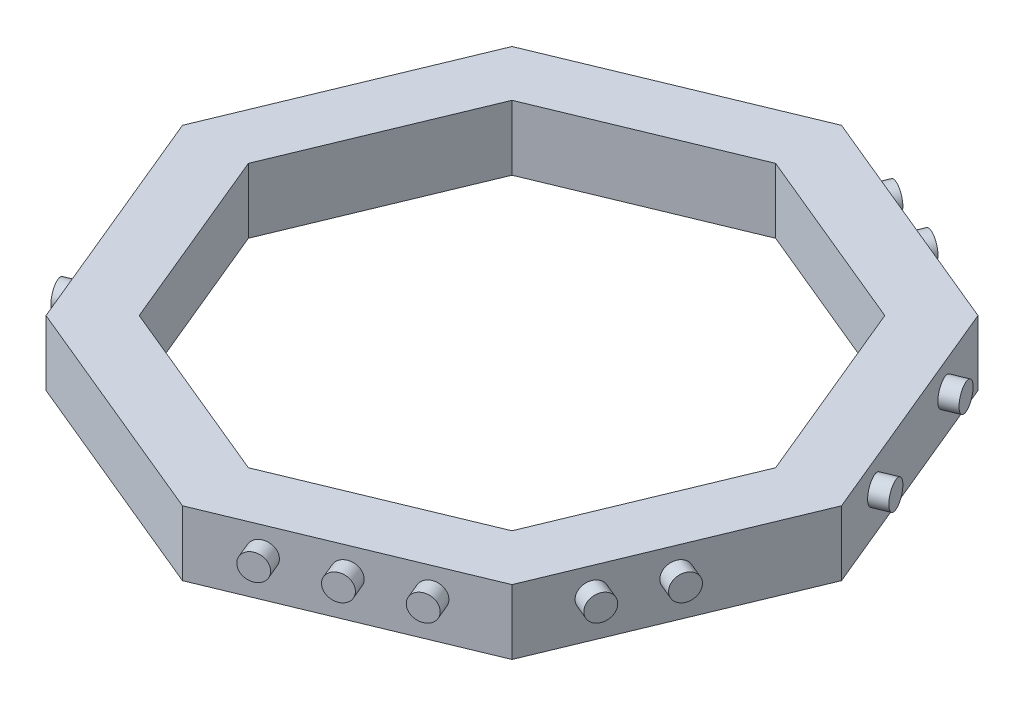
ISO-10303-21;
HEADER;
FILE_DESCRIPTION(('STEP AP214'),'2;1');
FILE_NAME('part.step','',(''),(''),'','','');
FILE_SCHEMA(('AUTOMOTIVE_DESIGN { 1 0 10303 214 1 1 1 1 }'));
ENDSEC;
DATA;
#1=APPLICATION_CONTEXT('core data for automotive mechanical design processes');
#2=APPLICATION_PROTOCOL_DEFINITION('international standard','automotive_design',2000,#1);
#3=PRODUCT_CONTEXT('',#1,'mechanical');
#4=PRODUCT('Part','Part','',(#3));
#5=PRODUCT_RELATED_PRODUCT_CATEGORY('part','',(#4));
#6=PRODUCT_DEFINITION_FORMATION('','',#4);
#7=PRODUCT_DEFINITION_CONTEXT('part definition',#1,'design');
#8=PRODUCT_DEFINITION('design','',#6,#7);
#9=PRODUCT_DEFINITION_SHAPE('','',#8);
#10=(LENGTH_UNIT() NAMED_UNIT(*) SI_UNIT(.MILLI.,.METRE.));
#11=(NAMED_UNIT(*) PLANE_ANGLE_UNIT() SI_UNIT($,.RADIAN.));
#12=(NAMED_UNIT(*) SI_UNIT($,.STERADIAN.) SOLID_ANGLE_UNIT());
#13=UNCERTAINTY_MEASURE_WITH_UNIT(LENGTH_MEASURE(1.E-05),#10,'distance_accuracy_value','');
#14=(GEOMETRIC_REPRESENTATION_CONTEXT(3) GLOBAL_UNCERTAINTY_ASSIGNED_CONTEXT((#13)) GLOBAL_UNIT_ASSIGNED_CONTEXT((#10,
#11,#12)) REPRESENTATION_CONTEXT('',''));
#15=CARTESIAN_POINT('',(0.,0.,0.));
#16=DIRECTION('',(0.,0.,1.));
#17=DIRECTION('',(1.,0.,0.));
#18=AXIS2_PLACEMENT_3D('',#15,#16,#17);
#19=CARTESIAN_POINT('',(17.9605122421385,5.,17.9605122421381));
#20=DIRECTION('',(-0.923879532511291,0.,-0.38268343236508));
#21=DIRECTION('',(-0.38268343236508,0.,0.923879532511291));
#22=AXIS2_PLACEMENT_3D('',#19,#20,#21);
#23=PLANE('',#22);
#24=CARTESIAN_POINT('',(21.6802561210693,3.,8.98025612106892));
#25=DIRECTION('',(-0.923879532511291,0.,-0.38268343236508));
#26=DIRECTION('',(-0.38268343236508,0.,0.923879532511291));
#27=AXIS2_PLACEMENT_3D('',#24,#25,#26);
#28=CIRCLE('',#27,1.);
#29=CARTESIAN_POINT('',(21.2975726887042,3.,9.90413565358022));
#30=VERTEX_POINT('',#29);
#31=EDGE_CURVE('E11',#30,#30,#28,.F.);
#32=ORIENTED_EDGE('',*,*,#31,.F.);
#33=EDGE_LOOP('',(#32));
#34=FACE_BOUND('',#33,.T.);
#35=CARTESIAN_POINT('',(19.7668389592439,3.,13.5996537836254));
#36=DIRECTION('',(-0.923879532511291,0.,-0.38268343236508));
#37=DIRECTION('',(-0.38268343236508,0.,0.923879532511291));
#38=AXIS2_PLACEMENT_3D('',#35,#36,#37);
#39=CIRCLE('',#38,1.);
#40=CARTESIAN_POINT('',(19.3841555268788,3.,14.5235333161367));
#41=VERTEX_POINT('',#40);
#42=EDGE_CURVE('E40',#41,#41,#39,.F.);
#43=ORIENTED_EDGE('',*,*,#42,.F.);
#44=EDGE_LOOP('',(#43));
#45=FACE_BOUND('',#44,.T.);
#46=DIRECTION('',(0.38268343236508,0.,-0.923879532511291));
#47=VECTOR('',#46,1.);
#48=CARTESIAN_POINT('',(17.9605122421385,0.,17.9605122421381));
#49=LINE('',#48,#47);
#50=CARTESIAN_POINT('',(17.9605122421385,0.,17.9605122421381));
#51=VERTEX_POINT('',#50);
#52=CARTESIAN_POINT('',(25.4,0.,-2.74086309204336E-13));
#53=VERTEX_POINT('',#52);
#54=EDGE_CURVE('E205',#51,#53,#49,.T.);
#55=ORIENTED_EDGE('',*,*,#54,.T.);
#56=DIRECTION('',(0.,-1.,0.));
#57=VECTOR('',#56,1.);
#58=CARTESIAN_POINT('',(25.4,5.,-2.74086309204336E-13));
#59=LINE('',#58,#57);
#60=CARTESIAN_POINT('',(25.4,5.,-2.74086309204336E-13));
#61=VERTEX_POINT('',#60);
#62=EDGE_CURVE('E271',#61,#53,#59,.T.);
#63=ORIENTED_EDGE('',*,*,#62,.F.);
#64=DIRECTION('',(0.38268343236508,0.,-0.923879532511291));
#65=VECTOR('',#64,1.);
#66=CARTESIAN_POINT('',(17.9605122421385,5.,17.9605122421381));
#67=LINE('',#66,#65);
#68=CARTESIAN_POINT('',(17.9605122421385,5.,17.9605122421381));
#69=VERTEX_POINT('',#68);
#70=EDGE_CURVE('E217',#69,#61,#67,.T.);
#71=ORIENTED_EDGE('',*,*,#70,.F.);
#72=DIRECTION('',(0.,-1.,0.));
#73=VECTOR('',#72,1.);
#74=CARTESIAN_POINT('',(17.9605122421385,5.,17.9605122421381));
#75=LINE('',#74,#73);
#76=EDGE_CURVE('E235',#69,#51,#75,.T.);
#77=ORIENTED_EDGE('',*,*,#76,.T.);
#78=EDGE_LOOP('',(#55,#63,#71,#77));
#79=FACE_BOUND('',#78,.T.);
#80=ADVANCED_FACE('F33',(#34,#45,#79),#23,.F.);
#81=CARTESIAN_POINT('',(25.4,5.,-2.74086309204336E-13));
#82=DIRECTION('',(-0.923879532511283,0.,0.3826834323651));
#83=DIRECTION('',(0.3826834323651,0.,0.923879532511283));
#84=AXIS2_PLACEMENT_3D('',#81,#82,#83);
#85=PLANE('',#84);
#86=CARTESIAN_POINT('',(19.7668389592436,3.,-13.5996537836258));
#87=DIRECTION('',(-0.923879532511283,0.,0.3826834323651));
#88=DIRECTION('',(0.3826834323651,0.,0.923879532511283));
#89=AXIS2_PLACEMENT_3D('',#86,#87,#88);
#90=CIRCLE('',#89,1.);
#91=CARTESIAN_POINT('',(20.1495223916087,3.,-12.6757742511145));
#92=VERTEX_POINT('',#91);
#93=EDGE_CURVE('E301',#92,#92,#90,.F.);
#94=ORIENTED_EDGE('',*,*,#93,.F.);
#95=EDGE_LOOP('',(#94));
#96=FACE_BOUND('',#95,.T.);
#97=CARTESIAN_POINT('',(23.5936732828946,3.,-4.36085845851299));
#98=DIRECTION('',(-0.923879532511283,0.,0.3826834323651));
#99=DIRECTION('',(0.3826834323651,0.,0.923879532511283));
#100=AXIS2_PLACEMENT_3D('',#97,#98,#99);
#101=CIRCLE('',#100,1.);
#102=CARTESIAN_POINT('',(23.9763567152597,3.,-3.43697892600171));
#103=VERTEX_POINT('',#102);
#104=EDGE_CURVE('E298',#103,#103,#101,.F.);
#105=ORIENTED_EDGE('',*,*,#104,.F.);
#106=EDGE_LOOP('',(#105));
#107=FACE_BOUND('',#106,.T.);
#108=DIRECTION('',(-0.3826834323651,0.,-0.923879532511283));
#109=VECTOR('',#108,1.);
#110=CARTESIAN_POINT('',(25.4,0.,-2.74086309204336E-13));
#111=LINE('',#110,#109);
#112=CARTESIAN_POINT('',(17.9605122421381,0.,-17.9605122421385));
#113=VERTEX_POINT('',#112);
#114=EDGE_CURVE('E238',#53,#113,#111,.T.);
#115=ORIENTED_EDGE('',*,*,#114,.T.);
#116=DIRECTION('',(0.,-1.,0.));
#117=VECTOR('',#116,1.);
#118=CARTESIAN_POINT('',(17.9605122421381,5.,-17.9605122421385));
#119=LINE('',#118,#117);
#120=CARTESIAN_POINT('',(17.9605122421381,5.,-17.9605122421385));
#121=VERTEX_POINT('',#120);
#122=EDGE_CURVE('E268',#121,#113,#119,.T.);
#123=ORIENTED_EDGE('',*,*,#122,.F.);
#124=DIRECTION('',(-0.3826834323651,0.,-0.923879532511283));
#125=VECTOR('',#124,1.);
#126=CARTESIAN_POINT('',(25.4,5.,-2.74086309204336E-13));
#127=LINE('',#126,#125);
#128=EDGE_CURVE('E220',#61,#121,#127,.T.);
#129=ORIENTED_EDGE('',*,*,#128,.F.);
#130=ORIENTED_EDGE('',*,*,#62,.T.);
#131=EDGE_LOOP('',(#115,#123,#129,#130));
#132=FACE_BOUND('',#131,.T.);
#133=ADVANCED_FACE('F310',(#96,#107,#132),#85,.F.);
#134=CARTESIAN_POINT('',(17.9605122421381,5.,-17.9605122421385));
#135=DIRECTION('',(-0.38268343236508,0.,0.923879532511291));
#136=DIRECTION('',(0.923879532511291,0.,0.38268343236508));
#137=AXIS2_PLACEMENT_3D('',#134,#135,#136);
#138=PLANE('',#137);
#139=CARTESIAN_POINT('',(4.36085845851247,3.,-23.5936732828947));
#140=DIRECTION('',(-0.38268343236508,0.,0.923879532511291));
#141=DIRECTION('',(0.923879532511291,0.,0.38268343236508));
#142=AXIS2_PLACEMENT_3D('',#139,#140,#141);
#143=CIRCLE('',#142,1.);
#144=CARTESIAN_POINT('',(5.28473799102376,3.,-23.2109898505296));
#145=VERTEX_POINT('',#144);
#146=EDGE_CURVE('E295',#145,#145,#143,.F.);
#147=ORIENTED_EDGE('',*,*,#146,.F.);
#148=EDGE_LOOP('',(#147));
#149=FACE_BOUND('',#148,.T.);
#150=CARTESIAN_POINT('',(8.98025612106893,3.,-21.6802561210693));
#151=DIRECTION('',(-0.38268343236508,0.,0.923879532511291));
#152=DIRECTION('',(0.923879532511291,0.,0.38268343236508));
#153=AXIS2_PLACEMENT_3D('',#150,#151,#152);
#154=CIRCLE('',#153,1.);
#155=CARTESIAN_POINT('',(9.90413565358022,3.,-21.2975726887042));
#156=VERTEX_POINT('',#155);
#157=EDGE_CURVE('E292',#156,#156,#154,.F.);
#158=ORIENTED_EDGE('',*,*,#157,.F.);
#159=EDGE_LOOP('',(#158));
#160=FACE_BOUND('',#159,.T.);
#161=DIRECTION('',(-0.923879532511291,0.,-0.38268343236508));
#162=VECTOR('',#161,1.);
#163=CARTESIAN_POINT('',(17.9605122421381,0.,-17.9605122421385));
#164=LINE('',#163,#162);
#165=CARTESIAN_POINT('',(-2.91433543964104E-13,0.,-25.4));
#166=VERTEX_POINT('',#165);
#167=EDGE_CURVE('E240',#113,#166,#164,.T.);
#168=ORIENTED_EDGE('',*,*,#167,.T.);
#169=DIRECTION('',(0.,-1.,0.));
#170=VECTOR('',#169,1.);
#171=CARTESIAN_POINT('',(-2.91433543964104E-13,5.,-25.4));
#172=LINE('',#171,#170);
#173=CARTESIAN_POINT('',(-2.91433543964104E-13,5.,-25.4));
#174=VERTEX_POINT('',#173);
#175=EDGE_CURVE('E265',#174,#166,#172,.T.);
#176=ORIENTED_EDGE('',*,*,#175,.F.);
#177=DIRECTION('',(-0.923879532511291,0.,-0.38268343236508));
#178=VECTOR('',#177,1.);
#179=CARTESIAN_POINT('',(17.9605122421381,5.,-17.9605122421385));
#180=LINE('',#179,#178);
#181=EDGE_CURVE('E223',#121,#174,#180,.T.);
#182=ORIENTED_EDGE('',*,*,#181,.F.);
#183=ORIENTED_EDGE('',*,*,#122,.T.);
#184=EDGE_LOOP('',(#168,#176,#182,#183));
#185=FACE_BOUND('',#184,.T.);
#186=ADVANCED_FACE('F348',(#149,#160,#185),#138,.F.);
#187=CARTESIAN_POINT('',(-2.91433543964104E-13,5.,-25.4));
#188=DIRECTION('',(0.3826834323651,0.,0.923879532511283));
#189=DIRECTION('',(0.923879532511283,0.,-0.3826834323651));
#190=AXIS2_PLACEMENT_3D('',#187,#188,#189);
#191=PLANE('',#190);
#192=CARTESIAN_POINT('',(-4.36085845851299,3.,-23.5936732828946));
#193=DIRECTION('',(0.3826834323651,0.,0.923879532511283));
#194=DIRECTION('',(0.923879532511283,0.,-0.3826834323651));
#195=AXIS2_PLACEMENT_3D('',#192,#193,#194);
#196=CIRCLE('',#195,1.);
#197=CARTESIAN_POINT('',(-3.43697892600171,3.,-23.9763567152597));
#198=VERTEX_POINT('',#197);
#199=EDGE_CURVE('E289',#198,#198,#196,.F.);
#200=ORIENTED_EDGE('',*,*,#199,.F.);
#201=EDGE_LOOP('',(#200));
#202=FACE_BOUND('',#201,.T.);
#203=DIRECTION('',(-0.923879532511283,0.,0.3826834323651));
#204=VECTOR('',#203,1.);
#205=CARTESIAN_POINT('',(-2.91433543964104E-13,0.,-25.4));
#206=LINE('',#205,#204);
#207=CARTESIAN_POINT('',(-17.9605122421385,0.,-17.9605122421381));
#208=VERTEX_POINT('',#207);
#209=EDGE_CURVE('E242',#166,#208,#206,.T.);
#210=ORIENTED_EDGE('',*,*,#209,.T.);
#211=DIRECTION('',(0.,-1.,0.));
#212=VECTOR('',#211,1.);
#213=CARTESIAN_POINT('',(-17.9605122421385,5.,-17.9605122421381));
#214=LINE('',#213,#212);
#215=CARTESIAN_POINT('',(-17.9605122421385,5.,-17.9605122421381));
#216=VERTEX_POINT('',#215);
#217=EDGE_CURVE('E262',#216,#208,#214,.T.);
#218=ORIENTED_EDGE('',*,*,#217,.F.);
#219=DIRECTION('',(-0.923879532511283,0.,0.3826834323651));
#220=VECTOR('',#219,1.);
#221=CARTESIAN_POINT('',(-2.91433543964104E-13,5.,-25.4));
#222=LINE('',#221,#220);
#223=EDGE_CURVE('E225',#174,#216,#222,.T.);
#224=ORIENTED_EDGE('',*,*,#223,.F.);
#225=ORIENTED_EDGE('',*,*,#175,.T.);
#226=EDGE_LOOP('',(#210,#218,#224,#225));
#227=FACE_BOUND('',#226,.T.);
#228=ADVANCED_FACE('F345',(#202,#227),#191,.F.);
#229=CARTESIAN_POINT('',(-17.9605122421385,5.,-17.9605122421381));
#230=DIRECTION('',(0.923879532511291,0.,0.382683432365079));
#231=DIRECTION('',(0.382683432365079,0.,-0.923879532511291));
#232=AXIS2_PLACEMENT_3D('',#229,#230,#231);
#233=PLANE('',#232);
#234=CARTESIAN_POINT('',(-21.6802561210693,3.,-8.98025612106892));
#235=DIRECTION('',(0.923879532511291,0.,0.382683432365079));
#236=DIRECTION('',(0.382683432365079,0.,-0.923879532511291));
#237=AXIS2_PLACEMENT_3D('',#234,#235,#236);
#238=CIRCLE('',#237,1.);
#239=CARTESIAN_POINT('',(-21.2975726887042,3.,-9.90413565358021));
#240=VERTEX_POINT('',#239);
#241=EDGE_CURVE('E286',#240,#240,#238,.F.);
#242=ORIENTED_EDGE('',*,*,#241,.F.);
#243=EDGE_LOOP('',(#242));
#244=FACE_BOUND('',#243,.T.);
#245=DIRECTION('',(-0.38268343236508,0.,0.923879532511291));
#246=VECTOR('',#245,1.);
#247=CARTESIAN_POINT('',(-17.9605122421385,0.,-17.9605122421381));
#248=LINE('',#247,#246);
#249=CARTESIAN_POINT('',(-25.4,0.,2.77555756156289E-13));
#250=VERTEX_POINT('',#249);
#251=EDGE_CURVE('E244',#208,#250,#248,.T.);
#252=ORIENTED_EDGE('',*,*,#251,.T.);
#253=DIRECTION('',(0.,-1.,0.));
#254=VECTOR('',#253,1.);
#255=CARTESIAN_POINT('',(-25.4,5.,2.77555756156289E-13));
#256=LINE('',#255,#254);
#257=CARTESIAN_POINT('',(-25.4,5.,2.77555756156289E-13));
#258=VERTEX_POINT('',#257);
#259=EDGE_CURVE('E259',#258,#250,#256,.T.);
#260=ORIENTED_EDGE('',*,*,#259,.F.);
#261=DIRECTION('',(-0.38268343236508,0.,0.923879532511291));
#262=VECTOR('',#261,1.);
#263=CARTESIAN_POINT('',(-17.9605122421385,5.,-17.9605122421381));
#264=LINE('',#263,#262);
#265=EDGE_CURVE('E227',#216,#258,#264,.T.);
#266=ORIENTED_EDGE('',*,*,#265,.F.);
#267=ORIENTED_EDGE('',*,*,#217,.T.);
#268=EDGE_LOOP('',(#252,#260,#266,#267));
#269=FACE_BOUND('',#268,.T.);
#270=ADVANCED_FACE('F341',(#244,#269),#233,.F.);
#271=CARTESIAN_POINT('',(-25.4,5.,2.77555756156289E-13));
#272=DIRECTION('',(0.923879532511283,0.,-0.3826834323651));
#273=DIRECTION('',(-0.3826834323651,0.,-0.923879532511283));
#274=AXIS2_PLACEMENT_3D('',#271,#272,#273);
#275=PLANE('',#274);
#276=CARTESIAN_POINT('',(-19.7668389592436,3.,13.5996537836258));
#277=DIRECTION('',(0.923879532511283,0.,-0.3826834323651));
#278=DIRECTION('',(-0.3826834323651,0.,-0.923879532511283));
#279=AXIS2_PLACEMENT_3D('',#276,#277,#278);
#280=CIRCLE('',#279,1.);
#281=CARTESIAN_POINT('',(-20.1495223916087,3.,12.6757742511145));
#282=VERTEX_POINT('',#281);
#283=EDGE_CURVE('E283',#282,#282,#280,.F.);
#284=ORIENTED_EDGE('',*,*,#283,.F.);
#285=EDGE_LOOP('',(#284));
#286=FACE_BOUND('',#285,.T.);
#287=DIRECTION('',(0.3826834323651,0.,0.923879532511283));
#288=VECTOR('',#287,1.);
#289=CARTESIAN_POINT('',(-25.4,0.,2.77555756156289E-13));
#290=LINE('',#289,#288);
#291=CARTESIAN_POINT('',(-17.9605122421381,0.,17.9605122421385));
#292=VERTEX_POINT('',#291);
#293=EDGE_CURVE('E246',#250,#292,#290,.T.);
#294=ORIENTED_EDGE('',*,*,#293,.T.);
#295=DIRECTION('',(0.,-1.,0.));
#296=VECTOR('',#295,1.);
#297=CARTESIAN_POINT('',(-17.9605122421381,5.,17.9605122421385));
#298=LINE('',#297,#296);
#299=CARTESIAN_POINT('',(-17.9605122421381,5.,17.9605122421385));
#300=VERTEX_POINT('',#299);
#301=EDGE_CURVE('E256',#300,#292,#298,.T.);
#302=ORIENTED_EDGE('',*,*,#301,.F.);
#303=DIRECTION('',(0.3826834323651,0.,0.923879532511283));
#304=VECTOR('',#303,1.);
#305=CARTESIAN_POINT('',(-25.4,5.,2.77555756156289E-13));
#306=LINE('',#305,#304);
#307=EDGE_CURVE('E229',#258,#300,#306,.T.);
#308=ORIENTED_EDGE('',*,*,#307,.F.);
#309=ORIENTED_EDGE('',*,*,#259,.T.);
#310=EDGE_LOOP('',(#294,#302,#308,#309));
#311=FACE_BOUND('',#310,.T.);
#312=ADVANCED_FACE('F336',(#286,#311),#275,.F.);
#313=CARTESIAN_POINT('',(-17.9605122421381,5.,17.9605122421385));
#314=DIRECTION('',(0.38268343236508,0.,-0.923879532511291));
#315=DIRECTION('',(-0.923879532511291,0.,-0.38268343236508));
#316=AXIS2_PLACEMENT_3D('',#313,#314,#315);
#317=PLANE('',#316);
#318=DIRECTION('',(0.923879532511291,0.,0.38268343236508));
#319=VECTOR('',#318,1.);
#320=CARTESIAN_POINT('',(-17.9605122421381,0.,17.9605122421385));
#321=LINE('',#320,#319);
#322=CARTESIAN_POINT('',(2.77555756156289E-13,0.,25.4));
#323=VERTEX_POINT('',#322);
#324=EDGE_CURVE('E248',#292,#323,#321,.T.);
#325=ORIENTED_EDGE('',*,*,#324,.T.);
#326=DIRECTION('',(0.,-1.,0.));
#327=VECTOR('',#326,1.);
#328=CARTESIAN_POINT('',(2.77555756156289E-13,5.,25.4));
#329=LINE('',#328,#327);
#330=CARTESIAN_POINT('',(2.77555756156289E-13,5.,25.4));
#331=VERTEX_POINT('',#330);
#332=EDGE_CURVE('E253',#331,#323,#329,.T.);
#333=ORIENTED_EDGE('',*,*,#332,.F.);
#334=DIRECTION('',(0.923879532511291,0.,0.38268343236508));
#335=VECTOR('',#334,1.);
#336=CARTESIAN_POINT('',(-17.9605122421381,5.,17.9605122421385));
#337=LINE('',#336,#335);
#338=EDGE_CURVE('E231',#300,#331,#337,.T.);
#339=ORIENTED_EDGE('',*,*,#338,.F.);
#340=ORIENTED_EDGE('',*,*,#301,.T.);
#341=EDGE_LOOP('',(#325,#333,#339,#340));
#342=FACE_BOUND('',#341,.T.);
#343=ADVANCED_FACE('F331',(#342),#317,.F.);
#344=CARTESIAN_POINT('',(2.77555756156289E-13,5.,25.4));
#345=DIRECTION('',(-0.3826834323651,0.,-0.923879532511283));
#346=DIRECTION('',(-0.923879532511283,0.,0.3826834323651));
#347=AXIS2_PLACEMENT_3D('',#344,#345,#346);
#348=PLANE('',#347);
#349=CARTESIAN_POINT('',(8.98025612106939,3.,21.6802561210691));
#350=DIRECTION('',(-0.3826834323651,0.,-0.923879532511283));
#351=DIRECTION('',(-0.923879532511283,0.,0.3826834323651));
#352=AXIS2_PLACEMENT_3D('',#349,#350,#351);
#353=CIRCLE('',#352,1.);
#354=CARTESIAN_POINT('',(8.05637658855811,3.,22.0629395534342));
#355=VERTEX_POINT('',#354);
#356=EDGE_CURVE('E280',#355,#355,#353,.F.);
#357=ORIENTED_EDGE('',*,*,#356,.F.);
#358=EDGE_LOOP('',(#357));
#359=FACE_BOUND('',#358,.T.);
#360=CARTESIAN_POINT('',(4.36085845851298,3.,23.5936732828946));
#361=DIRECTION('',(-0.3826834323651,0.,-0.923879532511283));
#362=DIRECTION('',(-0.923879532511283,0.,0.3826834323651));
#363=AXIS2_PLACEMENT_3D('',#360,#361,#362);
#364=CIRCLE('',#363,1.);
#365=CARTESIAN_POINT('',(3.4369789260017,3.,23.9763567152597));
#366=VERTEX_POINT('',#365);
#367=EDGE_CURVE('E277',#366,#366,#364,.F.);
#368=ORIENTED_EDGE('',*,*,#367,.F.);
#369=EDGE_LOOP('',(#368));
#370=FACE_BOUND('',#369,.T.);
#371=CARTESIAN_POINT('',(13.5996537836258,3.,19.7668389592436));
#372=DIRECTION('',(-0.3826834323651,0.,-0.923879532511283));
#373=DIRECTION('',(-0.923879532511283,0.,0.3826834323651));
#374=AXIS2_PLACEMENT_3D('',#371,#372,#373);
#375=CIRCLE('',#374,0.999999999999998);
#376=CARTESIAN_POINT('',(12.6757742511145,3.,20.1495223916087));
#377=VERTEX_POINT('',#376);
#378=EDGE_CURVE('E274',#377,#377,#375,.F.);
#379=ORIENTED_EDGE('',*,*,#378,.F.);
#380=EDGE_LOOP('',(#379));
#381=FACE_BOUND('',#380,.T.);
#382=DIRECTION('',(0.923879532511283,0.,-0.3826834323651));
#383=VECTOR('',#382,1.);
#384=CARTESIAN_POINT('',(2.77555756156289E-13,0.,25.4));
#385=LINE('',#384,#383);
#386=EDGE_CURVE('E221',#323,#51,#385,.T.);
#387=ORIENTED_EDGE('',*,*,#386,.T.);
#388=ORIENTED_EDGE('',*,*,#76,.F.);
#389=DIRECTION('',(0.923879532511283,0.,-0.3826834323651));
#390=VECTOR('',#389,1.);
#391=CARTESIAN_POINT('',(2.77555756156289E-13,5.,25.4));
#392=LINE('',#391,#390);
#393=EDGE_CURVE('E233',#331,#69,#392,.T.);
#394=ORIENTED_EDGE('',*,*,#393,.F.);
#395=ORIENTED_EDGE('',*,*,#332,.T.);
#396=EDGE_LOOP('',(#387,#388,#394,#395));
#397=FACE_BOUND('',#396,.T.);
#398=ADVANCED_FACE('F329',(#359,#370,#381,#397),#348,.F.);
#399=CARTESIAN_POINT('',(0.,5.,0.));
#400=DIRECTION('',(0.,1.,0.));
#401=DIRECTION('',(0.,0.,1.));
#402=AXIS2_PLACEMENT_3D('',#399,#400,#401);
#403=PLANE('',#402);
#404=DIRECTION('',(0.382683432365079,0.,-0.923879532511291));
#405=VECTOR('',#404,1.);
#406=CARTESIAN_POINT('',(14.3684097937108,5.,14.3684097937105));
#407=LINE('',#406,#405);
#408=CARTESIAN_POINT('',(14.3684097937108,5.,14.3684097937105));
#409=VERTEX_POINT('',#408);
#410=CARTESIAN_POINT('',(20.32,5.,-2.38524477946811E-13));
#411=VERTEX_POINT('',#410);
#412=EDGE_CURVE('E47',#409,#411,#407,.T.);
#413=ORIENTED_EDGE('',*,*,#412,.F.);
#414=DIRECTION('',(0.923879532511282,0.,-0.3826834323651));
#415=VECTOR('',#414,1.);
#416=CARTESIAN_POINT('',(2.40678638717616E-13,5.,20.32));
#417=LINE('',#416,#415);
#418=CARTESIAN_POINT('',(2.40678638717616E-13,5.,20.32));
#419=VERTEX_POINT('',#418);
#420=EDGE_CURVE('E164',#419,#409,#417,.T.);
#421=ORIENTED_EDGE('',*,*,#420,.F.);
#422=DIRECTION('',(0.923879532511291,0.,0.382683432365079));
#423=VECTOR('',#422,1.);
#424=CARTESIAN_POINT('',(-14.3684097937105,5.,14.3684097937108));
#425=LINE('',#424,#423);
#426=CARTESIAN_POINT('',(-14.3684097937105,5.,14.3684097937108));
#427=VERTEX_POINT('',#426);
#428=EDGE_CURVE('E167',#427,#419,#425,.T.);
#429=ORIENTED_EDGE('',*,*,#428,.F.);
#430=DIRECTION('',(0.3826834323651,0.,0.923879532511282));
#431=VECTOR('',#430,1.);
#432=CARTESIAN_POINT('',(-20.32,5.,2.42729561305328E-13));
#433=LINE('',#432,#431);
#434=CARTESIAN_POINT('',(-20.32,5.,2.42729561305328E-13));
#435=VERTEX_POINT('',#434);
#436=EDGE_CURVE('E198',#435,#427,#433,.T.);
#437=ORIENTED_EDGE('',*,*,#436,.F.);
#438=DIRECTION('',(-0.382683432365079,0.,0.923879532511291));
#439=VECTOR('',#438,1.);
#440=CARTESIAN_POINT('',(-14.3684097937108,5.,-14.3684097937105));
#441=LINE('',#440,#439);
#442=CARTESIAN_POINT('',(-14.3684097937108,5.,-14.3684097937105));
#443=VERTEX_POINT('',#442);
#444=EDGE_CURVE('E195',#443,#435,#441,.T.);
#445=ORIENTED_EDGE('',*,*,#444,.F.);
#446=DIRECTION('',(-0.923879532511282,0.,0.3826834323651));
#447=VECTOR('',#446,1.);
#448=CARTESIAN_POINT('',(-2.42838850685979E-13,5.,-20.32));
#449=LINE('',#448,#447);
#450=CARTESIAN_POINT('',(-2.42838850685979E-13,5.,-20.32));
#451=VERTEX_POINT('',#450);
#452=EDGE_CURVE('E192',#451,#443,#449,.T.);
#453=ORIENTED_EDGE('',*,*,#452,.F.);
#454=DIRECTION('',(-0.923879532511291,0.,-0.382683432365079));
#455=VECTOR('',#454,1.);
#456=CARTESIAN_POINT('',(14.3684097937105,5.,-14.3684097937108));
#457=LINE('',#456,#455);
#458=CARTESIAN_POINT('',(14.3684097937105,5.,-14.3684097937108));
#459=VERTEX_POINT('',#458);
#460=EDGE_CURVE('E189',#459,#451,#457,.T.);
#461=ORIENTED_EDGE('',*,*,#460,.F.);
#462=DIRECTION('',(-0.382683432365101,0.,-0.923879532511282));
#463=VECTOR('',#462,1.);
#464=CARTESIAN_POINT('',(20.32,5.,-2.3879865158925E-13));
#465=LINE('',#464,#463);
#466=EDGE_CURVE('E187',#411,#459,#465,.T.);
#467=ORIENTED_EDGE('',*,*,#466,.F.);
#468=EDGE_LOOP('',(#413,#421,#429,#437,#445,#453,#461,#467));
#469=FACE_BOUND('',#468,.T.);
#470=ORIENTED_EDGE('',*,*,#70,.T.);
#471=ORIENTED_EDGE('',*,*,#128,.T.);
#472=ORIENTED_EDGE('',*,*,#181,.T.);
#473=ORIENTED_EDGE('',*,*,#223,.T.);
#474=ORIENTED_EDGE('',*,*,#265,.T.);
#475=ORIENTED_EDGE('',*,*,#307,.T.);
#476=ORIENTED_EDGE('',*,*,#338,.T.);
#477=ORIENTED_EDGE('',*,*,#393,.T.);
#478=EDGE_LOOP('',(#470,#471,#472,#473,#474,#475,#476,#477));
#479=FACE_BOUND('',#478,.T.);
#480=ADVANCED_FACE('F324',(#469,#479),#403,.T.);
#481=CARTESIAN_POINT('',(0.,0.,0.));
#482=DIRECTION('',(0.,1.,0.));
#483=DIRECTION('',(0.,0.,1.));
#484=AXIS2_PLACEMENT_3D('',#481,#482,#483);
#485=PLANE('',#484);
#486=DIRECTION('',(0.923879532511282,0.,-0.3826834323651));
#487=VECTOR('',#486,1.);
#488=CARTESIAN_POINT('',(2.40678638717616E-13,0.,20.32));
#489=LINE('',#488,#487);
#490=CARTESIAN_POINT('',(2.40678638717616E-13,0.,20.32));
#491=VERTEX_POINT('',#490);
#492=CARTESIAN_POINT('',(14.3684097937108,0.,14.3684097937105));
#493=VERTEX_POINT('',#492);
#494=EDGE_CURVE('E153',#491,#493,#489,.T.);
#495=ORIENTED_EDGE('',*,*,#494,.T.);
#496=DIRECTION('',(0.382683432365079,0.,-0.923879532511291));
#497=VECTOR('',#496,1.);
#498=CARTESIAN_POINT('',(14.3684097937108,0.,14.3684097937105));
#499=LINE('',#498,#497);
#500=CARTESIAN_POINT('',(20.32,0.,-2.3879865158925E-13));
#501=VERTEX_POINT('',#500);
#502=EDGE_CURVE('E147',#493,#501,#499,.T.);
#503=ORIENTED_EDGE('',*,*,#502,.T.);
#504=DIRECTION('',(-0.382683432365101,0.,-0.923879532511282));
#505=VECTOR('',#504,1.);
#506=CARTESIAN_POINT('',(20.32,0.,-2.3879865158925E-13));
#507=LINE('',#506,#505);
#508=CARTESIAN_POINT('',(14.3684097937105,0.,-14.3684097937108));
#509=VERTEX_POINT('',#508);
#510=EDGE_CURVE('E156',#501,#509,#507,.T.);
#511=ORIENTED_EDGE('',*,*,#510,.T.);
#512=DIRECTION('',(-0.923879532511291,0.,-0.382683432365079));
#513=VECTOR('',#512,1.);
#514=CARTESIAN_POINT('',(14.3684097937105,0.,-14.3684097937108));
#515=LINE('',#514,#513);
#516=CARTESIAN_POINT('',(-2.42838850685979E-13,0.,-20.32));
#517=VERTEX_POINT('',#516);
#518=EDGE_CURVE('E55',#509,#517,#515,.T.);
#519=ORIENTED_EDGE('',*,*,#518,.T.);
#520=DIRECTION('',(-0.923879532511282,0.,0.3826834323651));
#521=VECTOR('',#520,1.);
#522=CARTESIAN_POINT('',(-2.42838850685979E-13,0.,-20.32));
#523=LINE('',#522,#521);
#524=CARTESIAN_POINT('',(-14.3684097937108,0.,-14.3684097937105));
#525=VERTEX_POINT('',#524);
#526=EDGE_CURVE('E174',#517,#525,#523,.T.);
#527=ORIENTED_EDGE('',*,*,#526,.T.);
#528=DIRECTION('',(-0.382683432365079,0.,0.923879532511291));
#529=VECTOR('',#528,1.);
#530=CARTESIAN_POINT('',(-14.3684097937108,0.,-14.3684097937105));
#531=LINE('',#530,#529);
#532=CARTESIAN_POINT('',(-20.32,0.,2.42729561305328E-13));
#533=VERTEX_POINT('',#532);
#534=EDGE_CURVE('E177',#525,#533,#531,.T.);
#535=ORIENTED_EDGE('',*,*,#534,.T.);
#536=DIRECTION('',(0.3826834323651,0.,0.923879532511282));
#537=VECTOR('',#536,1.);
#538=CARTESIAN_POINT('',(-20.32,0.,2.42729561305328E-13));
#539=LINE('',#538,#537);
#540=CARTESIAN_POINT('',(-14.3684097937105,0.,14.3684097937108));
#541=VERTEX_POINT('',#540);
#542=EDGE_CURVE('E180',#533,#541,#539,.T.);
#543=ORIENTED_EDGE('',*,*,#542,.T.);
#544=DIRECTION('',(0.923879532511291,0.,0.382683432365079));
#545=VECTOR('',#544,1.);
#546=CARTESIAN_POINT('',(-14.3684097937105,0.,14.3684097937108));
#547=LINE('',#546,#545);
#548=EDGE_CURVE('E183',#541,#491,#547,.T.);
#549=ORIENTED_EDGE('',*,*,#548,.T.);
#550=EDGE_LOOP('',(#495,#503,#511,#519,#527,#535,#543,#549));
#551=FACE_BOUND('',#550,.T.);
#552=ORIENTED_EDGE('',*,*,#54,.F.);
#553=ORIENTED_EDGE('',*,*,#386,.F.);
#554=ORIENTED_EDGE('',*,*,#324,.F.);
#555=ORIENTED_EDGE('',*,*,#293,.F.);
#556=ORIENTED_EDGE('',*,*,#251,.F.);
#557=ORIENTED_EDGE('',*,*,#209,.F.);
#558=ORIENTED_EDGE('',*,*,#167,.F.);
#559=ORIENTED_EDGE('',*,*,#114,.F.);
#560=EDGE_LOOP('',(#552,#553,#554,#555,#556,#557,#558,#559));
#561=FACE_BOUND('',#560,.T.);
#562=ADVANCED_FACE('F160',(#551,#561),#485,.F.);
#563=CARTESIAN_POINT('',(14.3684097937108,0.,14.3684097937105));
#564=DIRECTION('',(0.923879532511291,0.,0.382683432365079));
#565=DIRECTION('',(0.382683432365079,0.,-0.923879532511291));
#566=AXIS2_PLACEMENT_3D('',#563,#564,#565);
#567=PLANE('',#566);
#568=ORIENTED_EDGE('',*,*,#412,.T.);
#569=DIRECTION('',(0.,1.,0.));
#570=VECTOR('',#569,1.);
#571=CARTESIAN_POINT('',(20.32,0.,-2.3879865158925E-13));
#572=LINE('',#571,#570);
#573=EDGE_CURVE('E143',#501,#411,#572,.T.);
#574=ORIENTED_EDGE('',*,*,#573,.F.);
#575=ORIENTED_EDGE('',*,*,#502,.F.);
#576=DIRECTION('',(0.,1.,0.));
#577=VECTOR('',#576,1.);
#578=CARTESIAN_POINT('',(14.3684097937108,0.,14.3684097937105));
#579=LINE('',#578,#577);
#580=EDGE_CURVE('E203',#493,#409,#579,.T.);
#581=ORIENTED_EDGE('',*,*,#580,.T.);
#582=EDGE_LOOP('',(#568,#574,#575,#581));
#583=FACE_BOUND('',#582,.T.);
#584=ADVANCED_FACE('F145',(#583),#567,.F.);
#585=CARTESIAN_POINT('',(2.40678638717616E-13,0.,20.32));
#586=DIRECTION('',(0.3826834323651,0.,0.923879532511282));
#587=DIRECTION('',(0.923879532511282,0.,-0.3826834323651));
#588=AXIS2_PLACEMENT_3D('',#585,#586,#587);
#589=PLANE('',#588);
#590=ORIENTED_EDGE('',*,*,#420,.T.);
#591=ORIENTED_EDGE('',*,*,#580,.F.);
#592=ORIENTED_EDGE('',*,*,#494,.F.);
#593=DIRECTION('',(0.,1.,0.));
#594=VECTOR('',#593,1.);
#595=CARTESIAN_POINT('',(2.40678638717616E-13,0.,20.32));
#596=LINE('',#595,#594);
#597=EDGE_CURVE('E206',#491,#419,#596,.T.);
#598=ORIENTED_EDGE('',*,*,#597,.T.);
#599=EDGE_LOOP('',(#590,#591,#592,#598));
#600=FACE_BOUND('',#599,.T.);
#601=ADVANCED_FACE('F380',(#600),#589,.F.);
#602=CARTESIAN_POINT('',(-14.3684097937105,0.,14.3684097937108));
#603=DIRECTION('',(-0.382683432365079,0.,0.923879532511291));
#604=DIRECTION('',(0.923879532511291,0.,0.382683432365079));
#605=AXIS2_PLACEMENT_3D('',#602,#603,#604);
#606=PLANE('',#605);
#607=ORIENTED_EDGE('',*,*,#428,.T.);
#608=ORIENTED_EDGE('',*,*,#597,.F.);
#609=ORIENTED_EDGE('',*,*,#548,.F.);
#610=DIRECTION('',(0.,1.,0.));
#611=VECTOR('',#610,1.);
#612=CARTESIAN_POINT('',(-14.3684097937105,0.,14.3684097937108));
#613=LINE('',#612,#611);
#614=EDGE_CURVE('E208',#541,#427,#613,.T.);
#615=ORIENTED_EDGE('',*,*,#614,.T.);
#616=EDGE_LOOP('',(#607,#608,#609,#615));
#617=FACE_BOUND('',#616,.T.);
#618=ADVANCED_FACE('F398',(#617),#606,.F.);
#619=CARTESIAN_POINT('',(-20.32,0.,2.42729561305328E-13));
#620=DIRECTION('',(-0.923879532511282,0.,0.3826834323651));
#621=DIRECTION('',(0.3826834323651,0.,0.923879532511282));
#622=AXIS2_PLACEMENT_3D('',#619,#620,#621);
#623=PLANE('',#622);
#624=ORIENTED_EDGE('',*,*,#436,.T.);
#625=ORIENTED_EDGE('',*,*,#614,.F.);
#626=ORIENTED_EDGE('',*,*,#542,.F.);
#627=DIRECTION('',(0.,1.,0.));
#628=VECTOR('',#627,1.);
#629=CARTESIAN_POINT('',(-20.32,0.,2.42729561305328E-13));
#630=LINE('',#629,#628);
#631=EDGE_CURVE('E210',#533,#435,#630,.T.);
#632=ORIENTED_EDGE('',*,*,#631,.T.);
#633=EDGE_LOOP('',(#624,#625,#626,#632));
#634=FACE_BOUND('',#633,.T.);
#635=ADVANCED_FACE('F394',(#634),#623,.F.);
#636=CARTESIAN_POINT('',(-14.3684097937108,0.,-14.3684097937105));
#637=DIRECTION('',(-0.923879532511291,0.,-0.382683432365079));
#638=DIRECTION('',(-0.382683432365079,0.,0.923879532511291));
#639=AXIS2_PLACEMENT_3D('',#636,#637,#638);
#640=PLANE('',#639);
#641=ORIENTED_EDGE('',*,*,#444,.T.);
#642=ORIENTED_EDGE('',*,*,#631,.F.);
#643=ORIENTED_EDGE('',*,*,#534,.F.);
#644=DIRECTION('',(0.,1.,0.));
#645=VECTOR('',#644,1.);
#646=CARTESIAN_POINT('',(-14.3684097937108,0.,-14.3684097937105));
#647=LINE('',#646,#645);
#648=EDGE_CURVE('E212',#525,#443,#647,.T.);
#649=ORIENTED_EDGE('',*,*,#648,.T.);
#650=EDGE_LOOP('',(#641,#642,#643,#649));
#651=FACE_BOUND('',#650,.T.);
#652=ADVANCED_FACE('F390',(#651),#640,.F.);
#653=CARTESIAN_POINT('',(-2.42838850685979E-13,0.,-20.32));
#654=DIRECTION('',(-0.3826834323651,0.,-0.923879532511282));
#655=DIRECTION('',(-0.923879532511282,0.,0.3826834323651));
#656=AXIS2_PLACEMENT_3D('',#653,#654,#655);
#657=PLANE('',#656);
#658=ORIENTED_EDGE('',*,*,#452,.T.);
#659=ORIENTED_EDGE('',*,*,#648,.F.);
#660=ORIENTED_EDGE('',*,*,#526,.F.);
#661=DIRECTION('',(0.,1.,0.));
#662=VECTOR('',#661,1.);
#663=CARTESIAN_POINT('',(-2.42838850685979E-13,0.,-20.32));
#664=LINE('',#663,#662);
#665=EDGE_CURVE('E214',#517,#451,#664,.T.);
#666=ORIENTED_EDGE('',*,*,#665,.T.);
#667=EDGE_LOOP('',(#658,#659,#660,#666));
#668=FACE_BOUND('',#667,.T.);
#669=ADVANCED_FACE('F387',(#668),#657,.F.);
#670=CARTESIAN_POINT('',(14.3684097937105,0.,-14.3684097937108));
#671=DIRECTION('',(0.382683432365079,0.,-0.923879532511291));
#672=DIRECTION('',(-0.923879532511291,0.,-0.382683432365079));
#673=AXIS2_PLACEMENT_3D('',#670,#671,#672);
#674=PLANE('',#673);
#675=ORIENTED_EDGE('',*,*,#460,.T.);
#676=ORIENTED_EDGE('',*,*,#665,.F.);
#677=ORIENTED_EDGE('',*,*,#518,.F.);
#678=DIRECTION('',(0.,1.,0.));
#679=VECTOR('',#678,1.);
#680=CARTESIAN_POINT('',(14.3684097937105,0.,-14.3684097937108));
#681=LINE('',#680,#679);
#682=EDGE_CURVE('E152',#509,#459,#681,.T.);
#683=ORIENTED_EDGE('',*,*,#682,.T.);
#684=EDGE_LOOP('',(#675,#676,#677,#683));
#685=FACE_BOUND('',#684,.T.);
#686=ADVANCED_FACE('F384',(#685),#674,.F.);
#687=CARTESIAN_POINT('',(20.32,0.,-2.3879865158925E-13));
#688=DIRECTION('',(0.923879532511282,0.,-0.382683432365101));
#689=DIRECTION('',(-0.382683432365101,0.,-0.923879532511282));
#690=AXIS2_PLACEMENT_3D('',#687,#688,#689);
#691=PLANE('',#690);
#692=ORIENTED_EDGE('',*,*,#466,.T.);
#693=ORIENTED_EDGE('',*,*,#682,.F.);
#694=ORIENTED_EDGE('',*,*,#510,.F.);
#695=ORIENTED_EDGE('',*,*,#573,.T.);
#696=EDGE_LOOP('',(#692,#693,#694,#695));
#697=FACE_BOUND('',#696,.T.);
#698=ADVANCED_FACE('F157',(#697),#691,.F.);
#699=CARTESIAN_POINT('',(14.0780080740822,3.,20.9216883748827));
#700=DIRECTION('',(-0.3826834323651,0.,-0.923879532511283));
#701=DIRECTION('',(-0.923879532511283,0.,0.3826834323651));
#702=AXIS2_PLACEMENT_3D('',#699,#700,#701);
#703=CYLINDRICAL_SURFACE('',#702,0.999999999999998);
#704=CARTESIAN_POINT('',(14.0780080740822,3.,20.9216883748827));
#705=DIRECTION('',(0.3826834323651,0.,0.923879532511283));
#706=DIRECTION('',(0.923879532511283,0.,-0.3826834323651));
#707=AXIS2_PLACEMENT_3D('',#704,#705,#706);
#708=CIRCLE('',#707,0.999999999999998);
#709=CARTESIAN_POINT('',(15.0018876065935,3.,20.5390049425176));
#710=VERTEX_POINT('',#709);
#711=EDGE_CURVE('E170',#710,#710,#708,.T.);
#712=ORIENTED_EDGE('',*,*,#711,.F.);
#713=EDGE_LOOP('',(#712));
#714=FACE_BOUND('',#713,.T.);
#715=ORIENTED_EDGE('',*,*,#378,.T.);
#716=EDGE_LOOP('',(#715));
#717=FACE_BOUND('',#716,.T.);
#718=ADVANCED_FACE('F383',(#714,#717),#703,.T.);
#719=CARTESIAN_POINT('',(14.0780080740822,3.,20.9216883748827));
#720=DIRECTION('',(0.3826834323651,0.,0.923879532511283));
#721=DIRECTION('',(0.923879532511283,0.,-0.3826834323651));
#722=AXIS2_PLACEMENT_3D('',#719,#720,#721);
#723=PLANE('',#722);
#724=ORIENTED_EDGE('',*,*,#711,.T.);
#725=EDGE_LOOP('',(#724));
#726=FACE_BOUND('',#725,.T.);
#727=ADVANCED_FACE('F408',(#726),#723,.T.);
#728=CARTESIAN_POINT('',(4.83921274896935,3.,24.7485226985337));
#729=DIRECTION('',(-0.3826834323651,0.,-0.923879532511283));
#730=DIRECTION('',(-0.923879532511283,0.,0.3826834323651));
#731=AXIS2_PLACEMENT_3D('',#728,#729,#730);
#732=CYLINDRICAL_SURFACE('',#731,1.);
#733=CARTESIAN_POINT('',(4.83921274896935,3.,24.7485226985337));
#734=DIRECTION('',(0.3826834323651,0.,0.923879532511283));
#735=DIRECTION('',(0.923879532511283,0.,-0.3826834323651));
#736=AXIS2_PLACEMENT_3D('',#733,#734,#735);
#737=CIRCLE('',#736,1.);
#738=CARTESIAN_POINT('',(5.76309228148064,3.,24.3658392661686));
#739=VERTEX_POINT('',#738);
#740=EDGE_CURVE('E534',#739,#739,#737,.T.);
#741=ORIENTED_EDGE('',*,*,#740,.F.);
#742=EDGE_LOOP('',(#741));
#743=FACE_BOUND('',#742,.T.);
#744=ORIENTED_EDGE('',*,*,#367,.T.);
#745=EDGE_LOOP('',(#744));
#746=FACE_BOUND('',#745,.T.);
#747=ADVANCED_FACE('F412',(#743,#746),#732,.T.);
#748=CARTESIAN_POINT('',(4.83921274896935,3.,24.7485226985337));
#749=DIRECTION('',(0.3826834323651,0.,0.923879532511283));
#750=DIRECTION('',(0.923879532511283,0.,-0.3826834323651));
#751=AXIS2_PLACEMENT_3D('',#748,#749,#750);
#752=PLANE('',#751);
#753=ORIENTED_EDGE('',*,*,#740,.T.);
#754=EDGE_LOOP('',(#753));
#755=FACE_BOUND('',#754,.T.);
#756=ADVANCED_FACE('F414',(#755),#752,.T.);
#757=CARTESIAN_POINT('',(9.45861041152577,3.,22.8351055367082));
#758=DIRECTION('',(-0.3826834323651,0.,-0.923879532511283));
#759=DIRECTION('',(-0.923879532511283,0.,0.3826834323651));
#760=AXIS2_PLACEMENT_3D('',#757,#758,#759);
#761=CYLINDRICAL_SURFACE('',#760,1.);
#762=CARTESIAN_POINT('',(9.45861041152577,3.,22.8351055367082));
#763=DIRECTION('',(0.3826834323651,0.,0.923879532511283));
#764=DIRECTION('',(0.923879532511283,0.,-0.3826834323651));
#765=AXIS2_PLACEMENT_3D('',#762,#763,#764);
#766=CIRCLE('',#765,1.);
#767=CARTESIAN_POINT('',(10.3824899440371,3.,22.4524221043431));
#768=VERTEX_POINT('',#767);
#769=EDGE_CURVE('E532',#768,#768,#766,.T.);
#770=ORIENTED_EDGE('',*,*,#769,.F.);
#771=EDGE_LOOP('',(#770));
#772=FACE_BOUND('',#771,.T.);
#773=ORIENTED_EDGE('',*,*,#356,.T.);
#774=EDGE_LOOP('',(#773));
#775=FACE_BOUND('',#774,.T.);
#776=ADVANCED_FACE('F417',(#772,#775),#761,.T.);
#777=CARTESIAN_POINT('',(9.45861041152577,3.,22.8351055367082));
#778=DIRECTION('',(0.3826834323651,0.,0.923879532511283));
#779=DIRECTION('',(0.923879532511283,0.,-0.3826834323651));
#780=AXIS2_PLACEMENT_3D('',#777,#778,#779);
#781=PLANE('',#780);
#782=ORIENTED_EDGE('',*,*,#769,.T.);
#783=EDGE_LOOP('',(#782));
#784=FACE_BOUND('',#783,.T.);
#785=ADVANCED_FACE('F422',(#784),#781,.T.);
#786=CARTESIAN_POINT('',(-20.9216883748827,3.,14.0780080740822));
#787=DIRECTION('',(0.923879532511283,0.,-0.3826834323651));
#788=DIRECTION('',(-0.3826834323651,0.,-0.923879532511283));
#789=AXIS2_PLACEMENT_3D('',#786,#787,#788);
#790=CYLINDRICAL_SURFACE('',#789,1.);
#791=CARTESIAN_POINT('',(-20.9216883748827,3.,14.0780080740822));
#792=DIRECTION('',(-0.923879532511283,0.,0.3826834323651));
#793=DIRECTION('',(0.3826834323651,0.,0.923879532511283));
#794=AXIS2_PLACEMENT_3D('',#791,#792,#793);
#795=CIRCLE('',#794,1.);
#796=CARTESIAN_POINT('',(-20.5390049425176,3.,15.0018876065935));
#797=VERTEX_POINT('',#796);
#798=EDGE_CURVE('E529',#797,#797,#795,.T.);
#799=ORIENTED_EDGE('',*,*,#798,.F.);
#800=EDGE_LOOP('',(#799));
#801=FACE_BOUND('',#800,.T.);
#802=ORIENTED_EDGE('',*,*,#283,.T.);
#803=EDGE_LOOP('',(#802));
#804=FACE_BOUND('',#803,.T.);
#805=ADVANCED_FACE('F425',(#801,#804),#790,.T.);
#806=CARTESIAN_POINT('',(-20.9216883748827,3.,14.0780080740822));
#807=DIRECTION('',(-0.923879532511283,0.,0.3826834323651));
#808=DIRECTION('',(0.3826834323651,0.,0.923879532511283));
#809=AXIS2_PLACEMENT_3D('',#806,#807,#808);
#810=PLANE('',#809);
#811=ORIENTED_EDGE('',*,*,#798,.T.);
#812=EDGE_LOOP('',(#811));
#813=FACE_BOUND('',#812,.T.);
#814=ADVANCED_FACE('F432',(#813),#810,.T.);
#815=CARTESIAN_POINT('',(-22.8351055367084,3.,-9.45861041152527));
#816=DIRECTION('',(0.923879532511291,0.,0.382683432365079));
#817=DIRECTION('',(0.382683432365079,0.,-0.923879532511291));
#818=AXIS2_PLACEMENT_3D('',#815,#816,#817);
#819=CYLINDRICAL_SURFACE('',#818,1.);
#820=CARTESIAN_POINT('',(-22.8351055367084,3.,-9.45861041152527));
#821=DIRECTION('',(-0.923879532511291,0.,-0.38268343236508));
#822=DIRECTION('',(-0.38268343236508,0.,0.923879532511291));
#823=AXIS2_PLACEMENT_3D('',#820,#821,#822);
#824=CIRCLE('',#823,1.);
#825=CARTESIAN_POINT('',(-23.2177889690735,3.,-8.53473087901398));
#826=VERTEX_POINT('',#825);
#827=EDGE_CURVE('E526',#826,#826,#824,.T.);
#828=ORIENTED_EDGE('',*,*,#827,.F.);
#829=EDGE_LOOP('',(#828));
#830=FACE_BOUND('',#829,.T.);
#831=ORIENTED_EDGE('',*,*,#241,.T.);
#832=EDGE_LOOP('',(#831));
#833=FACE_BOUND('',#832,.T.);
#834=ADVANCED_FACE('F436',(#830,#833),#819,.T.);
#835=CARTESIAN_POINT('',(-22.8351055367084,3.,-9.45861041152527));
#836=DIRECTION('',(-0.923879532511291,0.,-0.38268343236508));
#837=DIRECTION('',(-0.38268343236508,0.,0.923879532511291));
#838=AXIS2_PLACEMENT_3D('',#835,#836,#837);
#839=PLANE('',#838);
#840=ORIENTED_EDGE('',*,*,#827,.T.);
#841=EDGE_LOOP('',(#840));
#842=FACE_BOUND('',#841,.T.);
#843=ADVANCED_FACE('F440',(#842),#839,.T.);
#844=CARTESIAN_POINT('',(-4.83921274896936,3.,-24.7485226985337));
#845=DIRECTION('',(0.3826834323651,0.,0.923879532511283));
#846=DIRECTION('',(0.923879532511283,0.,-0.3826834323651));
#847=AXIS2_PLACEMENT_3D('',#844,#845,#846);
#848=CYLINDRICAL_SURFACE('',#847,1.);
#849=CARTESIAN_POINT('',(-4.83921274896936,3.,-24.7485226985337));
#850=DIRECTION('',(-0.3826834323651,0.,-0.923879532511283));
#851=DIRECTION('',(-0.923879532511283,0.,0.3826834323651));
#852=AXIS2_PLACEMENT_3D('',#849,#850,#851);
#853=CIRCLE('',#852,1.);
#854=CARTESIAN_POINT('',(-5.76309228148065,3.,-24.3658392661686));
#855=VERTEX_POINT('',#854);
#856=EDGE_CURVE('E523',#855,#855,#853,.T.);
#857=ORIENTED_EDGE('',*,*,#856,.F.);
#858=EDGE_LOOP('',(#857));
#859=FACE_BOUND('',#858,.T.);
#860=ORIENTED_EDGE('',*,*,#199,.T.);
#861=EDGE_LOOP('',(#860));
#862=FACE_BOUND('',#861,.T.);
#863=ADVANCED_FACE('F444',(#859,#862),#848,.T.);
#864=CARTESIAN_POINT('',(-4.83921274896936,3.,-24.7485226985337));
#865=DIRECTION('',(-0.3826834323651,0.,-0.923879532511283));
#866=DIRECTION('',(-0.923879532511283,0.,0.3826834323651));
#867=AXIS2_PLACEMENT_3D('',#864,#865,#866);
#868=PLANE('',#867);
#869=ORIENTED_EDGE('',*,*,#856,.T.);
#870=EDGE_LOOP('',(#869));
#871=FACE_BOUND('',#870,.T.);
#872=ADVANCED_FACE('F448',(#871),#868,.T.);
#873=CARTESIAN_POINT('',(9.45861041152528,3.,-22.8351055367084));
#874=DIRECTION('',(-0.38268343236508,0.,0.923879532511291));
#875=DIRECTION('',(0.923879532511291,0.,0.38268343236508));
#876=AXIS2_PLACEMENT_3D('',#873,#874,#875);
#877=CYLINDRICAL_SURFACE('',#876,1.);
#878=CARTESIAN_POINT('',(9.45861041152528,3.,-22.8351055367084));
#879=DIRECTION('',(0.38268343236508,0.,-0.923879532511291));
#880=DIRECTION('',(-0.923879532511291,0.,-0.38268343236508));
#881=AXIS2_PLACEMENT_3D('',#878,#879,#880);
#882=CIRCLE('',#881,1.);
#883=CARTESIAN_POINT('',(8.53473087901398,3.,-23.2177889690735));
#884=VERTEX_POINT('',#883);
#885=EDGE_CURVE('E520',#884,#884,#882,.T.);
#886=ORIENTED_EDGE('',*,*,#885,.F.);
#887=EDGE_LOOP('',(#886));
#888=FACE_BOUND('',#887,.T.);
#889=ORIENTED_EDGE('',*,*,#157,.T.);
#890=EDGE_LOOP('',(#889));
#891=FACE_BOUND('',#890,.T.);
#892=ADVANCED_FACE('F452',(#888,#891),#877,.T.);
#893=CARTESIAN_POINT('',(9.45861041152528,3.,-22.8351055367084));
#894=DIRECTION('',(0.38268343236508,0.,-0.923879532511291));
#895=DIRECTION('',(-0.923879532511291,0.,-0.38268343236508));
#896=AXIS2_PLACEMENT_3D('',#893,#894,#895);
#897=PLANE('',#896);
#898=ORIENTED_EDGE('',*,*,#885,.T.);
#899=EDGE_LOOP('',(#898));
#900=FACE_BOUND('',#899,.T.);
#901=ADVANCED_FACE('F456',(#900),#897,.T.);
#902=CARTESIAN_POINT('',(4.83921274896882,3.,-24.7485226985338));
#903=DIRECTION('',(-0.38268343236508,0.,0.923879532511291));
#904=DIRECTION('',(0.923879532511291,0.,0.38268343236508));
#905=AXIS2_PLACEMENT_3D('',#902,#903,#904);
#906=CYLINDRICAL_SURFACE('',#905,1.);
#907=CARTESIAN_POINT('',(4.83921274896882,3.,-24.7485226985338));
#908=DIRECTION('',(0.38268343236508,0.,-0.923879532511291));
#909=DIRECTION('',(-0.923879532511291,0.,-0.38268343236508));
#910=AXIS2_PLACEMENT_3D('',#907,#908,#909);
#911=CIRCLE('',#910,1.);
#912=CARTESIAN_POINT('',(3.91533321645753,3.,-25.1312061308989));
#913=VERTEX_POINT('',#912);
#914=EDGE_CURVE('E517',#913,#913,#911,.T.);
#915=ORIENTED_EDGE('',*,*,#914,.F.);
#916=EDGE_LOOP('',(#915));
#917=FACE_BOUND('',#916,.T.);
#918=ORIENTED_EDGE('',*,*,#146,.T.);
#919=EDGE_LOOP('',(#918));
#920=FACE_BOUND('',#919,.T.);
#921=ADVANCED_FACE('F460',(#917,#920),#906,.T.);
#922=CARTESIAN_POINT('',(4.83921274896882,3.,-24.7485226985338));
#923=DIRECTION('',(0.38268343236508,0.,-0.923879532511291));
#924=DIRECTION('',(-0.923879532511291,0.,-0.38268343236508));
#925=AXIS2_PLACEMENT_3D('',#922,#923,#924);
#926=PLANE('',#925);
#927=ORIENTED_EDGE('',*,*,#914,.T.);
#928=EDGE_LOOP('',(#927));
#929=FACE_BOUND('',#928,.T.);
#930=ADVANCED_FACE('F462',(#929),#926,.T.);
#931=CARTESIAN_POINT('',(24.7485226985337,3.,-4.83921274896937));
#932=DIRECTION('',(-0.923879532511283,0.,0.3826834323651));
#933=DIRECTION('',(0.3826834323651,0.,0.923879532511283));
#934=AXIS2_PLACEMENT_3D('',#931,#932,#933);
#935=CYLINDRICAL_SURFACE('',#934,1.);
#936=CARTESIAN_POINT('',(24.7485226985337,3.,-4.83921274896937));
#937=DIRECTION('',(0.923879532511282,0.,-0.3826834323651));
#938=DIRECTION('',(-0.3826834323651,0.,-0.923879532511283));
#939=AXIS2_PLACEMENT_3D('',#936,#937,#938);
#940=CIRCLE('',#939,1.);
#941=CARTESIAN_POINT('',(24.3658392661686,3.,-5.76309228148066));
#942=VERTEX_POINT('',#941);
#943=EDGE_CURVE('E514',#942,#942,#940,.T.);
#944=ORIENTED_EDGE('',*,*,#943,.F.);
#945=EDGE_LOOP('',(#944));
#946=FACE_BOUND('',#945,.T.);
#947=ORIENTED_EDGE('',*,*,#104,.T.);
#948=EDGE_LOOP('',(#947));
#949=FACE_BOUND('',#948,.T.);
#950=ADVANCED_FACE('F465',(#946,#949),#935,.T.);
#951=CARTESIAN_POINT('',(24.7485226985337,3.,-4.83921274896937));
#952=DIRECTION('',(0.923879532511282,0.,-0.3826834323651));
#953=DIRECTION('',(-0.3826834323651,0.,-0.923879532511283));
#954=AXIS2_PLACEMENT_3D('',#951,#952,#953);
#955=PLANE('',#954);
#956=ORIENTED_EDGE('',*,*,#943,.T.);
#957=EDGE_LOOP('',(#956));
#958=FACE_BOUND('',#957,.T.);
#959=ADVANCED_FACE('F472',(#958),#955,.T.);
#960=CARTESIAN_POINT('',(20.9216883748827,3.,-14.0780080740822));
#961=DIRECTION('',(-0.923879532511283,0.,0.3826834323651));
#962=DIRECTION('',(0.3826834323651,0.,0.923879532511283));
#963=AXIS2_PLACEMENT_3D('',#960,#961,#962);
#964=CYLINDRICAL_SURFACE('',#963,1.);
#965=CARTESIAN_POINT('',(20.9216883748827,3.,-14.0780080740822));
#966=DIRECTION('',(0.923879532511282,0.,-0.3826834323651));
#967=DIRECTION('',(-0.3826834323651,0.,-0.923879532511283));
#968=AXIS2_PLACEMENT_3D('',#965,#966,#967);
#969=CIRCLE('',#968,1.);
#970=CARTESIAN_POINT('',(20.5390049425176,3.,-15.0018876065935));
#971=VERTEX_POINT('',#970);
#972=EDGE_CURVE('E509',#971,#971,#969,.T.);
#973=ORIENTED_EDGE('',*,*,#972,.F.);
#974=EDGE_LOOP('',(#973));
#975=FACE_BOUND('',#974,.T.);
#976=ORIENTED_EDGE('',*,*,#93,.T.);
#977=EDGE_LOOP('',(#976));
#978=FACE_BOUND('',#977,.T.);
#979=ADVANCED_FACE('F476',(#975,#978),#964,.T.);
#980=CARTESIAN_POINT('',(20.9216883748827,3.,-14.0780080740822));
#981=DIRECTION('',(0.923879532511282,0.,-0.3826834323651));
#982=DIRECTION('',(-0.3826834323651,0.,-0.923879532511283));
#983=AXIS2_PLACEMENT_3D('',#980,#981,#982);
#984=PLANE('',#983);
#985=ORIENTED_EDGE('',*,*,#972,.T.);
#986=EDGE_LOOP('',(#985));
#987=FACE_BOUND('',#986,.T.);
#988=ADVANCED_FACE('F478',(#987),#984,.T.);
#989=CARTESIAN_POINT('',(20.921688374883,3.,14.0780080740817));
#990=DIRECTION('',(-0.923879532511291,0.,-0.38268343236508));
#991=DIRECTION('',(-0.38268343236508,0.,0.923879532511291));
#992=AXIS2_PLACEMENT_3D('',#989,#990,#991);
#993=CYLINDRICAL_SURFACE('',#992,1.);
#994=CARTESIAN_POINT('',(20.921688374883,3.,14.0780080740817));
#995=DIRECTION('',(0.923879532511291,0.,0.38268343236508));
#996=DIRECTION('',(0.38268343236508,0.,-0.923879532511291));
#997=AXIS2_PLACEMENT_3D('',#994,#995,#996);
#998=CIRCLE('',#997,1.);
#999=CARTESIAN_POINT('',(21.3043718072481,3.,13.1541285415704));
#1000=VERTEX_POINT('',#999);
#1001=EDGE_CURVE('E506',#1000,#1000,#998,.T.);
#1002=ORIENTED_EDGE('',*,*,#1001,.F.);
#1003=EDGE_LOOP('',(#1002));
#1004=FACE_BOUND('',#1003,.T.);
#1005=ORIENTED_EDGE('',*,*,#42,.T.);
#1006=EDGE_LOOP('',(#1005));
#1007=FACE_BOUND('',#1006,.T.);
#1008=ADVANCED_FACE('F306',(#1004,#1007),#993,.T.);
#1009=CARTESIAN_POINT('',(20.921688374883,3.,14.0780080740817));
#1010=DIRECTION('',(0.923879532511291,0.,0.38268343236508));
#1011=DIRECTION('',(0.38268343236508,0.,-0.923879532511291));
#1012=AXIS2_PLACEMENT_3D('',#1009,#1010,#1011);
#1013=PLANE('',#1012);
#1014=ORIENTED_EDGE('',*,*,#1001,.T.);
#1015=EDGE_LOOP('',(#1014));
#1016=FACE_BOUND('',#1015,.T.);
#1017=ADVANCED_FACE('F487',(#1016),#1013,.T.);
#1018=CARTESIAN_POINT('',(22.8351055367084,3.,9.45861041152527));
#1019=DIRECTION('',(-0.923879532511291,0.,-0.38268343236508));
#1020=DIRECTION('',(-0.38268343236508,0.,0.923879532511291));
#1021=AXIS2_PLACEMENT_3D('',#1018,#1019,#1020);
#1022=CYLINDRICAL_SURFACE('',#1021,1.);
#1023=CARTESIAN_POINT('',(22.8351055367084,3.,9.45861041152527));
#1024=DIRECTION('',(0.923879532511291,0.,0.38268343236508));
#1025=DIRECTION('',(0.38268343236508,0.,-0.923879532511291));
#1026=AXIS2_PLACEMENT_3D('',#1023,#1024,#1025);
#1027=CIRCLE('',#1026,1.);
#1028=CARTESIAN_POINT('',(23.2177889690735,3.,8.53473087901398));
#1029=VERTEX_POINT('',#1028);
#1030=EDGE_CURVE('E504',#1029,#1029,#1027,.T.);
#1031=ORIENTED_EDGE('',*,*,#1030,.F.);
#1032=EDGE_LOOP('',(#1031));
#1033=FACE_BOUND('',#1032,.T.);
#1034=ORIENTED_EDGE('',*,*,#31,.T.);
#1035=EDGE_LOOP('',(#1034));
#1036=FACE_BOUND('',#1035,.T.);
#1037=ADVANCED_FACE('F491',(#1033,#1036),#1022,.T.);
#1038=CARTESIAN_POINT('',(22.8351055367084,3.,9.45861041152527));
#1039=DIRECTION('',(0.923879532511291,0.,0.38268343236508));
#1040=DIRECTION('',(0.38268343236508,0.,-0.923879532511291));
#1041=AXIS2_PLACEMENT_3D('',#1038,#1039,#1040);
#1042=PLANE('',#1041);
#1043=ORIENTED_EDGE('',*,*,#1030,.T.);
#1044=EDGE_LOOP('',(#1043));
#1045=FACE_BOUND('',#1044,.T.);
#1046=ADVANCED_FACE('F493',(#1045),#1042,.T.);
#1047=CLOSED_SHELL('',(#80,#133,#186,#228,#270,#312,#343,#398,#480,#562,#584,#601,#618,#635,
#652,#669,#686,#698,#718,#727,#747,#756,#776,#785,#805,#814,#834,#843,#863,#872,#892,#901,#921,
#930,#950,#959,#979,#988,#1008,#1017,#1037,#1046));
#1048=MANIFOLD_SOLID_BREP('B2',#1047);
#1049=ADVANCED_BREP_SHAPE_REPRESENTATION('',(#18,#1048),#14);
#1050=SHAPE_DEFINITION_REPRESENTATION(#9,#1049);
ENDSEC;
END-ISO-10303-21;
